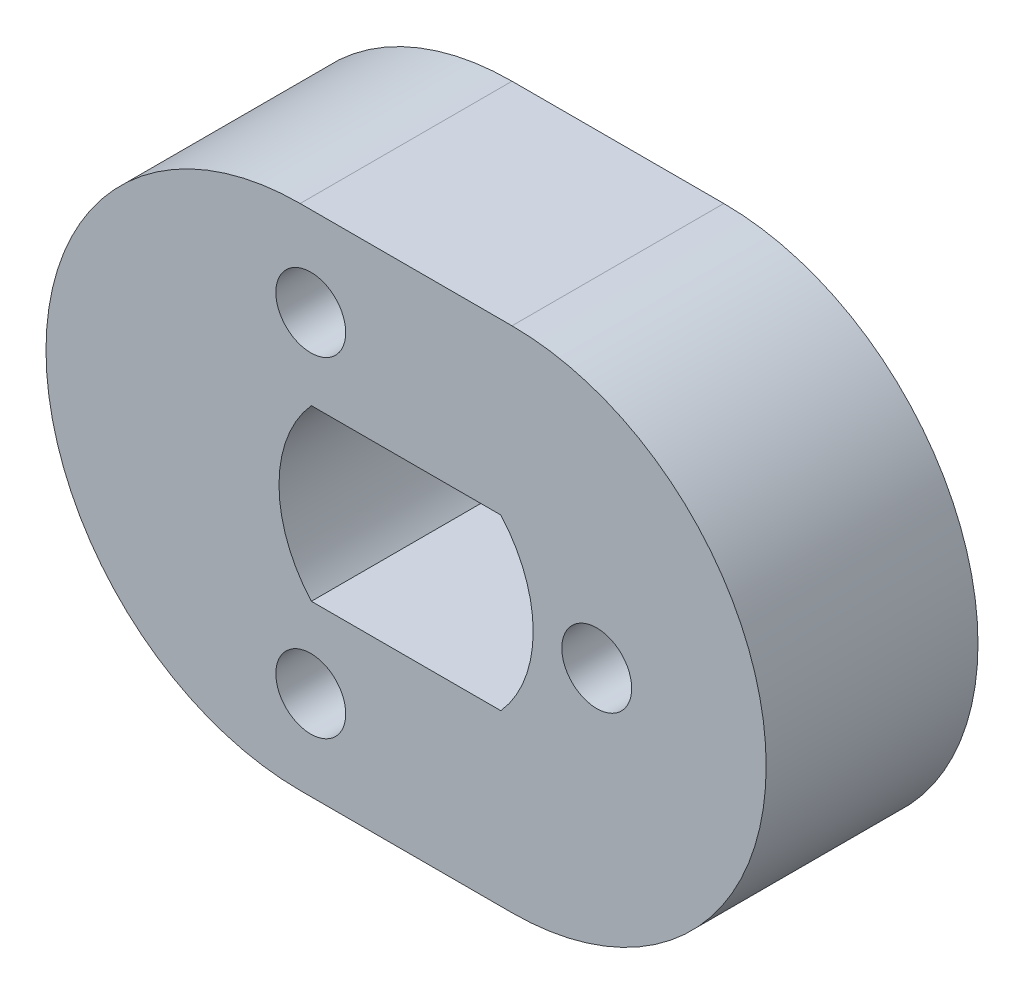
ISO-10303-21;
HEADER;
FILE_DESCRIPTION(('STEP AP214'),'2;1');
FILE_NAME('part.step','',(''),(''),'','','');
FILE_SCHEMA(('AUTOMOTIVE_DESIGN { 1 0 10303 214 1 1 1 1 }'));
ENDSEC;
DATA;
#1=APPLICATION_CONTEXT('core data for automotive mechanical design processes');
#2=APPLICATION_PROTOCOL_DEFINITION('international standard','automotive_design',2000,#1);
#3=PRODUCT_CONTEXT('',#1,'mechanical');
#4=PRODUCT('Part','Part','',(#3));
#5=PRODUCT_RELATED_PRODUCT_CATEGORY('part','',(#4));
#6=PRODUCT_DEFINITION_FORMATION('','',#4);
#7=PRODUCT_DEFINITION_CONTEXT('part definition',#1,'design');
#8=PRODUCT_DEFINITION('design','',#6,#7);
#9=PRODUCT_DEFINITION_SHAPE('','',#8);
#10=(LENGTH_UNIT() NAMED_UNIT(*) SI_UNIT(.MILLI.,.METRE.));
#11=(NAMED_UNIT(*) PLANE_ANGLE_UNIT() SI_UNIT($,.RADIAN.));
#12=(NAMED_UNIT(*) SI_UNIT($,.STERADIAN.) SOLID_ANGLE_UNIT());
#13=UNCERTAINTY_MEASURE_WITH_UNIT(LENGTH_MEASURE(1.E-05),#10,'distance_accuracy_value','');
#14=(GEOMETRIC_REPRESENTATION_CONTEXT(3) GLOBAL_UNCERTAINTY_ASSIGNED_CONTEXT((#13)) GLOBAL_UNIT_ASSIGNED_CONTEXT((#10,
#11,#12)) REPRESENTATION_CONTEXT('',''));
#15=CARTESIAN_POINT('',(0.,0.,0.));
#16=DIRECTION('',(0.,0.,1.));
#17=DIRECTION('',(1.,0.,0.));
#18=AXIS2_PLACEMENT_3D('',#15,#16,#17);
#19=CARTESIAN_POINT('',(5.,0.,10.));
#20=DIRECTION('',(0.,0.,-1.));
#21=DIRECTION('',(-1.,0.,0.));
#22=AXIS2_PLACEMENT_3D('',#19,#20,#21);
#23=CYLINDRICAL_SURFACE('',#22,6.);
#24=CARTESIAN_POINT('',(5.,0.,10.));
#25=DIRECTION('',(0.,0.,1.));
#26=DIRECTION('',(1.,0.,0.));
#27=AXIS2_PLACEMENT_3D('',#24,#25,#26);
#28=CIRCLE('',#27,6.);
#29=CARTESIAN_POINT('',(0.527864045000421,4.,10.));
#30=VERTEX_POINT('',#29);
#31=CARTESIAN_POINT('',(0.527864045000421,-4.,10.));
#32=VERTEX_POINT('',#31);
#33=EDGE_CURVE('E110',#30,#32,#28,.T.);
#34=ORIENTED_EDGE('',*,*,#33,.T.);
#35=DIRECTION('',(0.,0.,1.));
#36=VECTOR('',#35,1.);
#37=CARTESIAN_POINT('',(0.527864045000421,-4.,0.));
#38=LINE('',#37,#36);
#39=CARTESIAN_POINT('',(0.527864045000421,-4.,0.));
#40=VERTEX_POINT('',#39);
#41=EDGE_CURVE('E60',#40,#32,#38,.T.);
#42=ORIENTED_EDGE('',*,*,#41,.F.);
#43=CARTESIAN_POINT('',(5.,0.,0.));
#44=DIRECTION('',(0.,0.,1.));
#45=DIRECTION('',(1.,0.,0.));
#46=AXIS2_PLACEMENT_3D('',#43,#44,#45);
#47=CIRCLE('',#46,6.);
#48=CARTESIAN_POINT('',(0.527864045000421,4.,0.));
#49=VERTEX_POINT('',#48);
#50=EDGE_CURVE('E111',#49,#40,#47,.T.);
#51=ORIENTED_EDGE('',*,*,#50,.F.);
#52=DIRECTION('',(0.,0.,1.));
#53=VECTOR('',#52,1.);
#54=CARTESIAN_POINT('',(0.527864045000421,4.,0.));
#55=LINE('',#54,#53);
#56=EDGE_CURVE('E128',#49,#30,#55,.T.);
#57=ORIENTED_EDGE('',*,*,#56,.T.);
#58=EDGE_LOOP('',(#34,#42,#51,#57));
#59=FACE_BOUND('',#58,.T.);
#60=ADVANCED_FACE('F37',(#59),#23,.F.);
#61=CARTESIAN_POINT('',(9.47213595499958,-4.,0.));
#62=VERTEX_POINT('',#61);
#63=CARTESIAN_POINT('',(9.47213595499958,4.,0.));
#64=VERTEX_POINT('',#63);
#65=EDGE_CURVE('E52',#62,#64,#47,.T.);
#66=ORIENTED_EDGE('',*,*,#65,.F.);
#67=DIRECTION('',(0.,0.,1.));
#68=VECTOR('',#67,1.);
#69=CARTESIAN_POINT('',(9.47213595499958,-4.,0.));
#70=LINE('',#69,#68);
#71=CARTESIAN_POINT('',(9.47213595499958,-4.,10.));
#72=VERTEX_POINT('',#71);
#73=EDGE_CURVE('E114',#62,#72,#70,.T.);
#74=ORIENTED_EDGE('',*,*,#73,.T.);
#75=CARTESIAN_POINT('',(9.47213595499958,4.,10.));
#76=VERTEX_POINT('',#75);
#77=EDGE_CURVE('E103',#72,#76,#28,.T.);
#78=ORIENTED_EDGE('',*,*,#77,.T.);
#79=DIRECTION('',(0.,0.,1.));
#80=VECTOR('',#79,1.);
#81=CARTESIAN_POINT('',(9.47213595499958,4.,0.));
#82=LINE('',#81,#80);
#83=EDGE_CURVE('E130',#64,#76,#82,.T.);
#84=ORIENTED_EDGE('',*,*,#83,.F.);
#85=EDGE_LOOP('',(#66,#74,#78,#84));
#86=FACE_BOUND('',#85,.T.);
#87=ADVANCED_FACE('F115',(#86),#23,.F.);
#88=CARTESIAN_POINT('',(0.,0.,10.));
#89=DIRECTION('',(0.,0.,1.));
#90=DIRECTION('',(1.,0.,0.));
#91=AXIS2_PLACEMENT_3D('',#88,#89,#90);
#92=PLANE('',#91);
#93=CARTESIAN_POINT('',(0.500000000000075,-7.79422863405998,10.));
#94=DIRECTION('',(0.,0.,1.));
#95=DIRECTION('',(1.,0.,0.));
#96=AXIS2_PLACEMENT_3D('',#93,#94,#95);
#97=CIRCLE('',#96,1.65);
#98=CARTESIAN_POINT('',(2.15000000000007,-7.79422863405998,10.));
#99=VERTEX_POINT('',#98);
#100=EDGE_CURVE('E132',#99,#99,#97,.T.);
#101=ORIENTED_EDGE('',*,*,#100,.F.);
#102=EDGE_LOOP('',(#101));
#103=FACE_BOUND('',#102,.T.);
#104=CARTESIAN_POINT('',(0.499999999999966,7.79422863405992,10.));
#105=DIRECTION('',(0.,0.,1.));
#106=DIRECTION('',(1.,0.,0.));
#107=AXIS2_PLACEMENT_3D('',#104,#105,#106);
#108=CIRCLE('',#107,1.65);
#109=CARTESIAN_POINT('',(2.14999999999996,7.79422863405992,10.));
#110=VERTEX_POINT('',#109);
#111=EDGE_CURVE('E140',#110,#110,#108,.T.);
#112=ORIENTED_EDGE('',*,*,#111,.F.);
#113=EDGE_LOOP('',(#112));
#114=FACE_BOUND('',#113,.T.);
#115=CARTESIAN_POINT('',(14.,0.,10.));
#116=DIRECTION('',(0.,0.,1.));
#117=DIRECTION('',(1.,0.,0.));
#118=AXIS2_PLACEMENT_3D('',#115,#116,#117);
#119=CIRCLE('',#118,1.65);
#120=CARTESIAN_POINT('',(15.65,0.,10.));
#121=VERTEX_POINT('',#120);
#122=EDGE_CURVE('E146',#121,#121,#119,.T.);
#123=ORIENTED_EDGE('',*,*,#122,.F.);
#124=EDGE_LOOP('',(#123));
#125=FACE_BOUND('',#124,.T.);
#126=CARTESIAN_POINT('',(0.,0.,10.));
#127=DIRECTION('',(0.,0.,1.));
#128=DIRECTION('',(1.,0.,0.));
#129=AXIS2_PLACEMENT_3D('',#126,#127,#128);
#130=CIRCLE('',#129,12.);
#131=CARTESIAN_POINT('',(0.,12.,10.));
#132=VERTEX_POINT('',#131);
#133=CARTESIAN_POINT('',(0.,-12.,10.));
#134=VERTEX_POINT('',#133);
#135=EDGE_CURVE('E154',#132,#134,#130,.T.);
#136=ORIENTED_EDGE('',*,*,#135,.T.);
#137=DIRECTION('',(1.,0.,0.));
#138=VECTOR('',#137,1.);
#139=CARTESIAN_POINT('',(0.,-12.,10.));
#140=LINE('',#139,#138);
#141=CARTESIAN_POINT('',(10.,-12.,10.));
#142=VERTEX_POINT('',#141);
#143=EDGE_CURVE('E157',#134,#142,#140,.T.);
#144=ORIENTED_EDGE('',*,*,#143,.T.);
#145=CARTESIAN_POINT('',(10.,0.,10.));
#146=DIRECTION('',(0.,0.,1.));
#147=DIRECTION('',(1.,0.,0.));
#148=AXIS2_PLACEMENT_3D('',#145,#146,#147);
#149=CIRCLE('',#148,12.);
#150=CARTESIAN_POINT('',(10.,12.,10.));
#151=VERTEX_POINT('',#150);
#152=EDGE_CURVE('E160',#142,#151,#149,.T.);
#153=ORIENTED_EDGE('',*,*,#152,.T.);
#154=DIRECTION('',(-1.,0.,0.));
#155=VECTOR('',#154,1.);
#156=CARTESIAN_POINT('',(0.,12.,10.));
#157=LINE('',#156,#155);
#158=EDGE_CURVE('E162',#151,#132,#157,.T.);
#159=ORIENTED_EDGE('',*,*,#158,.T.);
#160=EDGE_LOOP('',(#136,#144,#153,#159));
#161=FACE_BOUND('',#160,.T.);
#162=ORIENTED_EDGE('',*,*,#33,.F.);
#163=DIRECTION('',(1.,0.,0.));
#164=VECTOR('',#163,1.);
#165=CARTESIAN_POINT('',(0.,4.,10.));
#166=LINE('',#165,#164);
#167=EDGE_CURVE('E108',#30,#76,#166,.T.);
#168=ORIENTED_EDGE('',*,*,#167,.T.);
#169=ORIENTED_EDGE('',*,*,#77,.F.);
#170=DIRECTION('',(1.,0.,0.));
#171=VECTOR('',#170,1.);
#172=CARTESIAN_POINT('',(0.,-4.,10.));
#173=LINE('',#172,#171);
#174=EDGE_CURVE('E106',#32,#72,#173,.T.);
#175=ORIENTED_EDGE('',*,*,#174,.F.);
#176=EDGE_LOOP('',(#162,#168,#169,#175));
#177=FACE_BOUND('',#176,.T.);
#178=ADVANCED_FACE('F104',(#103,#114,#125,#161,#177),#92,.T.);
#179=CARTESIAN_POINT('',(0.,0.,0.));
#180=DIRECTION('',(0.,0.,1.));
#181=DIRECTION('',(1.,0.,0.));
#182=AXIS2_PLACEMENT_3D('',#179,#180,#181);
#183=PLANE('',#182);
#184=CARTESIAN_POINT('',(0.500000000000075,-7.79422863405998,0.));
#185=DIRECTION('',(0.,0.,1.));
#186=DIRECTION('',(1.,0.,0.));
#187=AXIS2_PLACEMENT_3D('',#184,#185,#186);
#188=CIRCLE('',#187,1.65);
#189=CARTESIAN_POINT('',(2.15000000000007,-7.79422863405998,0.));
#190=VERTEX_POINT('',#189);
#191=EDGE_CURVE('E137',#190,#190,#188,.T.);
#192=ORIENTED_EDGE('',*,*,#191,.T.);
#193=EDGE_LOOP('',(#192));
#194=FACE_BOUND('',#193,.T.);
#195=CARTESIAN_POINT('',(0.499999999999966,7.79422863405992,0.));
#196=DIRECTION('',(0.,0.,1.));
#197=DIRECTION('',(1.,0.,0.));
#198=AXIS2_PLACEMENT_3D('',#195,#196,#197);
#199=CIRCLE('',#198,1.65);
#200=CARTESIAN_POINT('',(2.14999999999996,7.79422863405992,0.));
#201=VERTEX_POINT('',#200);
#202=EDGE_CURVE('E143',#201,#201,#199,.T.);
#203=ORIENTED_EDGE('',*,*,#202,.T.);
#204=EDGE_LOOP('',(#203));
#205=FACE_BOUND('',#204,.T.);
#206=CARTESIAN_POINT('',(14.,0.,0.));
#207=DIRECTION('',(0.,0.,1.));
#208=DIRECTION('',(1.,0.,0.));
#209=AXIS2_PLACEMENT_3D('',#206,#207,#208);
#210=CIRCLE('',#209,1.65);
#211=CARTESIAN_POINT('',(15.65,0.,0.));
#212=VERTEX_POINT('',#211);
#213=EDGE_CURVE('E149',#212,#212,#210,.T.);
#214=ORIENTED_EDGE('',*,*,#213,.T.);
#215=EDGE_LOOP('',(#214));
#216=FACE_BOUND('',#215,.T.);
#217=CARTESIAN_POINT('',(0.,0.,0.));
#218=DIRECTION('',(0.,0.,1.));
#219=DIRECTION('',(1.,0.,0.));
#220=AXIS2_PLACEMENT_3D('',#217,#218,#219);
#221=CIRCLE('',#220,12.);
#222=CARTESIAN_POINT('',(0.,12.,0.));
#223=VERTEX_POINT('',#222);
#224=CARTESIAN_POINT('',(0.,-12.,0.));
#225=VERTEX_POINT('',#224);
#226=EDGE_CURVE('E152',#223,#225,#221,.T.);
#227=ORIENTED_EDGE('',*,*,#226,.F.);
#228=DIRECTION('',(-1.,0.,0.));
#229=VECTOR('',#228,1.);
#230=CARTESIAN_POINT('',(0.,12.,0.));
#231=LINE('',#230,#229);
#232=CARTESIAN_POINT('',(10.,12.,0.));
#233=VERTEX_POINT('',#232);
#234=EDGE_CURVE('E158',#233,#223,#231,.T.);
#235=ORIENTED_EDGE('',*,*,#234,.F.);
#236=CARTESIAN_POINT('',(10.,0.,0.));
#237=DIRECTION('',(0.,0.,1.));
#238=DIRECTION('',(1.,0.,0.));
#239=AXIS2_PLACEMENT_3D('',#236,#237,#238);
#240=CIRCLE('',#239,12.);
#241=CARTESIAN_POINT('',(10.,-12.,0.));
#242=VERTEX_POINT('',#241);
#243=EDGE_CURVE('E169',#242,#233,#240,.T.);
#244=ORIENTED_EDGE('',*,*,#243,.F.);
#245=DIRECTION('',(1.,0.,0.));
#246=VECTOR('',#245,1.);
#247=CARTESIAN_POINT('',(0.,-12.,0.));
#248=LINE('',#247,#246);
#249=EDGE_CURVE('E167',#225,#242,#248,.T.);
#250=ORIENTED_EDGE('',*,*,#249,.F.);
#251=EDGE_LOOP('',(#227,#235,#244,#250));
#252=FACE_BOUND('',#251,.T.);
#253=ORIENTED_EDGE('',*,*,#50,.T.);
#254=DIRECTION('',(1.,0.,0.));
#255=VECTOR('',#254,1.);
#256=CARTESIAN_POINT('',(0.,-4.,0.));
#257=LINE('',#256,#255);
#258=EDGE_CURVE('E120',#40,#62,#257,.T.);
#259=ORIENTED_EDGE('',*,*,#258,.T.);
#260=ORIENTED_EDGE('',*,*,#65,.T.);
#261=DIRECTION('',(1.,0.,0.));
#262=VECTOR('',#261,1.);
#263=CARTESIAN_POINT('',(0.,4.,0.));
#264=LINE('',#263,#262);
#265=EDGE_CURVE('E125',#49,#64,#264,.T.);
#266=ORIENTED_EDGE('',*,*,#265,.F.);
#267=EDGE_LOOP('',(#253,#259,#260,#266));
#268=FACE_BOUND('',#267,.T.);
#269=ADVANCED_FACE('F187',(#194,#205,#216,#252,#268),#183,.F.);
#270=CARTESIAN_POINT('',(0.,0.,10.));
#271=DIRECTION('',(0.,0.,-1.));
#272=DIRECTION('',(-1.,0.,0.));
#273=AXIS2_PLACEMENT_3D('',#270,#271,#272);
#274=CYLINDRICAL_SURFACE('',#273,12.);
#275=ORIENTED_EDGE('',*,*,#226,.T.);
#276=DIRECTION('',(0.,0.,-1.));
#277=VECTOR('',#276,1.);
#278=CARTESIAN_POINT('',(0.,-12.,10.));
#279=LINE('',#278,#277);
#280=EDGE_CURVE('E11',#134,#225,#279,.T.);
#281=ORIENTED_EDGE('',*,*,#280,.F.);
#282=ORIENTED_EDGE('',*,*,#135,.F.);
#283=DIRECTION('',(0.,0.,-1.));
#284=VECTOR('',#283,1.);
#285=CARTESIAN_POINT('',(0.,12.,10.));
#286=LINE('',#285,#284);
#287=EDGE_CURVE('E164',#132,#223,#286,.T.);
#288=ORIENTED_EDGE('',*,*,#287,.T.);
#289=EDGE_LOOP('',(#275,#281,#282,#288));
#290=FACE_BOUND('',#289,.T.);
#291=ADVANCED_FACE('F39',(#290),#274,.T.);
#292=CARTESIAN_POINT('',(0.,-12.,10.));
#293=DIRECTION('',(0.,1.,0.));
#294=DIRECTION('',(0.,0.,1.));
#295=AXIS2_PLACEMENT_3D('',#292,#293,#294);
#296=PLANE('',#295);
#297=ORIENTED_EDGE('',*,*,#249,.T.);
#298=DIRECTION('',(0.,0.,-1.));
#299=VECTOR('',#298,1.);
#300=CARTESIAN_POINT('',(10.,-12.,10.));
#301=LINE('',#300,#299);
#302=EDGE_CURVE('E45',#142,#242,#301,.T.);
#303=ORIENTED_EDGE('',*,*,#302,.F.);
#304=ORIENTED_EDGE('',*,*,#143,.F.);
#305=ORIENTED_EDGE('',*,*,#280,.T.);
#306=EDGE_LOOP('',(#297,#303,#304,#305));
#307=FACE_BOUND('',#306,.T.);
#308=ADVANCED_FACE('F197',(#307),#296,.F.);
#309=CARTESIAN_POINT('',(10.,0.,10.));
#310=DIRECTION('',(0.,0.,-1.));
#311=DIRECTION('',(-1.,0.,0.));
#312=AXIS2_PLACEMENT_3D('',#309,#310,#311);
#313=CYLINDRICAL_SURFACE('',#312,12.);
#314=ORIENTED_EDGE('',*,*,#243,.T.);
#315=DIRECTION('',(0.,0.,-1.));
#316=VECTOR('',#315,1.);
#317=CARTESIAN_POINT('',(10.,12.,10.));
#318=LINE('',#317,#316);
#319=EDGE_CURVE('E174',#151,#233,#318,.T.);
#320=ORIENTED_EDGE('',*,*,#319,.F.);
#321=ORIENTED_EDGE('',*,*,#152,.F.);
#322=ORIENTED_EDGE('',*,*,#302,.T.);
#323=EDGE_LOOP('',(#314,#320,#321,#322));
#324=FACE_BOUND('',#323,.T.);
#325=ADVANCED_FACE('F181',(#324),#313,.T.);
#326=CARTESIAN_POINT('',(0.,12.,10.));
#327=DIRECTION('',(0.,-1.,0.));
#328=DIRECTION('',(0.,0.,-1.));
#329=AXIS2_PLACEMENT_3D('',#326,#327,#328);
#330=PLANE('',#329);
#331=ORIENTED_EDGE('',*,*,#234,.T.);
#332=ORIENTED_EDGE('',*,*,#287,.F.);
#333=ORIENTED_EDGE('',*,*,#158,.F.);
#334=ORIENTED_EDGE('',*,*,#319,.T.);
#335=EDGE_LOOP('',(#331,#332,#333,#334));
#336=FACE_BOUND('',#335,.T.);
#337=ADVANCED_FACE('F191',(#336),#330,.F.);
#338=CARTESIAN_POINT('',(14.,0.,10.));
#339=DIRECTION('',(0.,0.,1.));
#340=DIRECTION('',(1.,0.,0.));
#341=AXIS2_PLACEMENT_3D('',#338,#339,#340);
#342=CYLINDRICAL_SURFACE('',#341,1.65);
#343=ORIENTED_EDGE('',*,*,#213,.F.);
#344=EDGE_LOOP('',(#343));
#345=FACE_BOUND('',#344,.T.);
#346=ORIENTED_EDGE('',*,*,#122,.T.);
#347=EDGE_LOOP('',(#346));
#348=FACE_BOUND('',#347,.T.);
#349=ADVANCED_FACE('F212',(#345,#348),#342,.F.);
#350=CARTESIAN_POINT('',(0.499999999999966,7.79422863405992,10.));
#351=DIRECTION('',(0.,0.,1.));
#352=DIRECTION('',(1.,0.,0.));
#353=AXIS2_PLACEMENT_3D('',#350,#351,#352);
#354=CYLINDRICAL_SURFACE('',#353,1.65);
#355=ORIENTED_EDGE('',*,*,#202,.F.);
#356=EDGE_LOOP('',(#355));
#357=FACE_BOUND('',#356,.T.);
#358=ORIENTED_EDGE('',*,*,#111,.T.);
#359=EDGE_LOOP('',(#358));
#360=FACE_BOUND('',#359,.T.);
#361=ADVANCED_FACE('F224',(#357,#360),#354,.F.);
#362=CARTESIAN_POINT('',(0.500000000000075,-7.79422863405998,10.));
#363=DIRECTION('',(0.,0.,1.));
#364=DIRECTION('',(1.,0.,0.));
#365=AXIS2_PLACEMENT_3D('',#362,#363,#364);
#366=CYLINDRICAL_SURFACE('',#365,1.65);
#367=ORIENTED_EDGE('',*,*,#191,.F.);
#368=EDGE_LOOP('',(#367));
#369=FACE_BOUND('',#368,.T.);
#370=ORIENTED_EDGE('',*,*,#100,.T.);
#371=EDGE_LOOP('',(#370));
#372=FACE_BOUND('',#371,.T.);
#373=ADVANCED_FACE('F229',(#369,#372),#366,.F.);
#374=CARTESIAN_POINT('',(0.,4.,0.));
#375=DIRECTION('',(0.,-1.,0.));
#376=DIRECTION('',(0.,0.,-1.));
#377=AXIS2_PLACEMENT_3D('',#374,#375,#376);
#378=PLANE('',#377);
#379=ORIENTED_EDGE('',*,*,#167,.F.);
#380=ORIENTED_EDGE('',*,*,#56,.F.);
#381=ORIENTED_EDGE('',*,*,#265,.T.);
#382=ORIENTED_EDGE('',*,*,#83,.T.);
#383=EDGE_LOOP('',(#379,#380,#381,#382));
#384=FACE_BOUND('',#383,.T.);
#385=ADVANCED_FACE('F239',(#384),#378,.T.);
#386=CARTESIAN_POINT('',(0.,-4.,0.));
#387=DIRECTION('',(0.,-1.,0.));
#388=DIRECTION('',(0.,0.,-1.));
#389=AXIS2_PLACEMENT_3D('',#386,#387,#388);
#390=PLANE('',#389);
#391=ORIENTED_EDGE('',*,*,#174,.T.);
#392=ORIENTED_EDGE('',*,*,#73,.F.);
#393=ORIENTED_EDGE('',*,*,#258,.F.);
#394=ORIENTED_EDGE('',*,*,#41,.T.);
#395=EDGE_LOOP('',(#391,#392,#393,#394));
#396=FACE_BOUND('',#395,.T.);
#397=ADVANCED_FACE('F119',(#396),#390,.F.);
#398=CLOSED_SHELL('',(#60,#87,#178,#269,#291,#308,#325,#337,#349,#361,#373,#385,#397));
#399=MANIFOLD_SOLID_BREP('B2',#398);
#400=ADVANCED_BREP_SHAPE_REPRESENTATION('',(#18,#399),#14);
#401=SHAPE_DEFINITION_REPRESENTATION(#9,#400);
ENDSEC;
END-ISO-10303-21;
